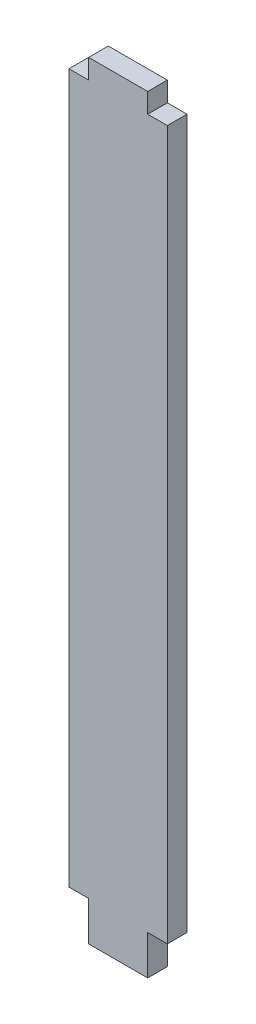
ISO-10303-21;
HEADER;
FILE_DESCRIPTION(('STEP AP214'),'2;1');
FILE_NAME('part.step','',(''),(''),'','','');
FILE_SCHEMA(('AUTOMOTIVE_DESIGN { 1 0 10303 214 1 1 1 1 }'));
ENDSEC;
DATA;
#1=APPLICATION_CONTEXT('core data for automotive mechanical design processes');
#2=APPLICATION_PROTOCOL_DEFINITION('international standard','automotive_design',2000,#1);
#3=PRODUCT_CONTEXT('',#1,'mechanical');
#4=PRODUCT('Part','Part','',(#3));
#5=PRODUCT_RELATED_PRODUCT_CATEGORY('part','',(#4));
#6=PRODUCT_DEFINITION_FORMATION('','',#4);
#7=PRODUCT_DEFINITION_CONTEXT('part definition',#1,'design');
#8=PRODUCT_DEFINITION('design','',#6,#7);
#9=PRODUCT_DEFINITION_SHAPE('','',#8);
#10=(LENGTH_UNIT() NAMED_UNIT(*) SI_UNIT(.MILLI.,.METRE.));
#11=(NAMED_UNIT(*) PLANE_ANGLE_UNIT() SI_UNIT($,.RADIAN.));
#12=(NAMED_UNIT(*) SI_UNIT($,.STERADIAN.) SOLID_ANGLE_UNIT());
#13=UNCERTAINTY_MEASURE_WITH_UNIT(LENGTH_MEASURE(1.E-05),#10,'distance_accuracy_value','');
#14=(GEOMETRIC_REPRESENTATION_CONTEXT(3) GLOBAL_UNCERTAINTY_ASSIGNED_CONTEXT((#13)) GLOBAL_UNIT_ASSIGNED_CONTEXT((#10,
#11,#12)) REPRESENTATION_CONTEXT('',''));
#15=CARTESIAN_POINT('',(0.,0.,0.));
#16=DIRECTION('',(0.,0.,1.));
#17=DIRECTION('',(1.,0.,0.));
#18=AXIS2_PLACEMENT_3D('',#15,#16,#17);
#19=CARTESIAN_POINT('',(214.630903416816,0.,-5.));
#20=DIRECTION('',(-1.,0.,0.));
#21=DIRECTION('',(0.,-1.,0.));
#22=AXIS2_PLACEMENT_3D('',#19,#20,#21);
#23=PLANE('',#22);
#24=DIRECTION('',(0.,-1.,0.));
#25=VECTOR('',#24,1.);
#26=CARTESIAN_POINT('',(214.630903416816,0.,0.));
#27=LINE('',#26,#25);
#28=CARTESIAN_POINT('',(214.630903416816,191.207377047342,0.));
#29=VERTEX_POINT('',#28);
#30=CARTESIAN_POINT('',(214.630903416816,11.2073770473418,0.));
#31=VERTEX_POINT('',#30);
#32=EDGE_CURVE('E162',#29,#31,#27,.T.);
#33=ORIENTED_EDGE('',*,*,#32,.F.);
#34=DIRECTION('',(0.,0.,1.));
#35=VECTOR('',#34,1.);
#36=CARTESIAN_POINT('',(214.630903416816,191.207377047342,-5.));
#37=LINE('',#36,#35);
#38=CARTESIAN_POINT('',(214.630903416816,191.207377047342,-5.));
#39=VERTEX_POINT('',#38);
#40=EDGE_CURVE('E11',#39,#29,#37,.T.);
#41=ORIENTED_EDGE('',*,*,#40,.F.);
#42=DIRECTION('',(0.,-1.,0.));
#43=VECTOR('',#42,1.);
#44=CARTESIAN_POINT('',(214.630903416816,0.,-5.));
#45=LINE('',#44,#43);
#46=CARTESIAN_POINT('',(214.630903416816,11.2073770473418,-5.));
#47=VERTEX_POINT('',#46);
#48=EDGE_CURVE('E190',#39,#47,#45,.T.);
#49=ORIENTED_EDGE('',*,*,#48,.T.);
#50=DIRECTION('',(0.,0.,1.));
#51=VECTOR('',#50,1.);
#52=CARTESIAN_POINT('',(214.630903416816,11.2073770473418,-5.));
#53=LINE('',#52,#51);
#54=EDGE_CURVE('E42',#47,#31,#53,.T.);
#55=ORIENTED_EDGE('',*,*,#54,.T.);
#56=EDGE_LOOP('',(#33,#41,#49,#55));
#57=FACE_BOUND('',#56,.T.);
#58=ADVANCED_FACE('F39',(#57),#23,.T.);
#59=CARTESIAN_POINT('',(0.,191.207377047342,-5.));
#60=DIRECTION('',(0.,-1.,0.));
#61=DIRECTION('',(0.,0.,-1.));
#62=AXIS2_PLACEMENT_3D('',#59,#60,#61);
#63=PLANE('',#62);
#64=DIRECTION('',(1.,0.,0.));
#65=VECTOR('',#64,1.);
#66=CARTESIAN_POINT('',(0.,191.207377047342,0.));
#67=LINE('',#66,#65);
#68=CARTESIAN_POINT('',(219.630903416816,191.207377047342,0.));
#69=VERTEX_POINT('',#68);
#70=EDGE_CURVE('E96',#29,#69,#67,.T.);
#71=ORIENTED_EDGE('',*,*,#70,.T.);
#72=DIRECTION('',(0.,0.,1.));
#73=VECTOR('',#72,1.);
#74=CARTESIAN_POINT('',(219.630903416816,191.207377047342,-5.));
#75=LINE('',#74,#73);
#76=CARTESIAN_POINT('',(219.630903416816,191.207377047342,-5.));
#77=VERTEX_POINT('',#76);
#78=EDGE_CURVE('E48',#77,#69,#75,.T.);
#79=ORIENTED_EDGE('',*,*,#78,.F.);
#80=DIRECTION('',(1.,0.,0.));
#81=VECTOR('',#80,1.);
#82=CARTESIAN_POINT('',(0.,191.207377047342,-5.));
#83=LINE('',#82,#81);
#84=EDGE_CURVE('E140',#39,#77,#83,.T.);
#85=ORIENTED_EDGE('',*,*,#84,.F.);
#86=ORIENTED_EDGE('',*,*,#40,.T.);
#87=EDGE_LOOP('',(#71,#79,#85,#86));
#88=FACE_BOUND('',#87,.T.);
#89=ADVANCED_FACE('F266',(#88),#63,.F.);
#90=CARTESIAN_POINT('',(219.630903416816,0.,-5.));
#91=DIRECTION('',(1.,0.,0.));
#92=DIRECTION('',(0.,0.,-1.));
#93=AXIS2_PLACEMENT_3D('',#90,#91,#92);
#94=PLANE('',#93);
#95=DIRECTION('',(0.,1.,0.));
#96=VECTOR('',#95,1.);
#97=CARTESIAN_POINT('',(219.630903416816,0.,0.));
#98=LINE('',#97,#96);
#99=CARTESIAN_POINT('',(219.630903416816,196.207377047342,0.));
#100=VERTEX_POINT('',#99);
#101=EDGE_CURVE('E147',#69,#100,#98,.T.);
#102=ORIENTED_EDGE('',*,*,#101,.T.);
#103=DIRECTION('',(0.,0.,1.));
#104=VECTOR('',#103,1.);
#105=CARTESIAN_POINT('',(219.630903416816,196.207377047342,-5.));
#106=LINE('',#105,#104);
#107=CARTESIAN_POINT('',(219.630903416816,196.207377047342,-5.));
#108=VERTEX_POINT('',#107);
#109=EDGE_CURVE('E144',#108,#100,#106,.T.);
#110=ORIENTED_EDGE('',*,*,#109,.F.);
#111=DIRECTION('',(0.,1.,0.));
#112=VECTOR('',#111,1.);
#113=CARTESIAN_POINT('',(219.630903416816,0.,-5.));
#114=LINE('',#113,#112);
#115=EDGE_CURVE('E133',#77,#108,#114,.T.);
#116=ORIENTED_EDGE('',*,*,#115,.F.);
#117=ORIENTED_EDGE('',*,*,#78,.T.);
#118=EDGE_LOOP('',(#102,#110,#116,#117));
#119=FACE_BOUND('',#118,.T.);
#120=ADVANCED_FACE('F145',(#119),#94,.F.);
#121=CARTESIAN_POINT('',(0.,196.207377047342,-5.));
#122=DIRECTION('',(0.,-1.,0.));
#123=DIRECTION('',(0.,0.,-1.));
#124=AXIS2_PLACEMENT_3D('',#121,#122,#123);
#125=PLANE('',#124);
#126=DIRECTION('',(1.,0.,0.));
#127=VECTOR('',#126,1.);
#128=CARTESIAN_POINT('',(0.,196.207377047342,0.));
#129=LINE('',#128,#127);
#130=CARTESIAN_POINT('',(234.630903416816,196.207377047342,0.));
#131=VERTEX_POINT('',#130);
#132=EDGE_CURVE('E187',#100,#131,#129,.T.);
#133=ORIENTED_EDGE('',*,*,#132,.T.);
#134=DIRECTION('',(0.,0.,1.));
#135=VECTOR('',#134,1.);
#136=CARTESIAN_POINT('',(234.630903416816,196.207377047342,-5.));
#137=LINE('',#136,#135);
#138=CARTESIAN_POINT('',(234.630903416816,196.207377047342,-5.));
#139=VERTEX_POINT('',#138);
#140=EDGE_CURVE('E151',#139,#131,#137,.T.);
#141=ORIENTED_EDGE('',*,*,#140,.F.);
#142=DIRECTION('',(1.,0.,0.));
#143=VECTOR('',#142,1.);
#144=CARTESIAN_POINT('',(0.,196.207377047342,-5.));
#145=LINE('',#144,#143);
#146=EDGE_CURVE('E138',#108,#139,#145,.T.);
#147=ORIENTED_EDGE('',*,*,#146,.F.);
#148=ORIENTED_EDGE('',*,*,#109,.T.);
#149=EDGE_LOOP('',(#133,#141,#147,#148));
#150=FACE_BOUND('',#149,.T.);
#151=ADVANCED_FACE('F153',(#150),#125,.F.);
#152=CARTESIAN_POINT('',(234.630903416817,1.30246315630975E-12,-5.));
#153=DIRECTION('',(1.,0.,0.));
#154=DIRECTION('',(0.,1.,0.));
#155=AXIS2_PLACEMENT_3D('',#152,#153,#154);
#156=PLANE('',#155);
#157=DIRECTION('',(0.,1.,0.));
#158=VECTOR('',#157,1.);
#159=CARTESIAN_POINT('',(234.630903416817,1.30246315630975E-12,0.));
#160=LINE('',#159,#158);
#161=CARTESIAN_POINT('',(234.630903416816,191.207377047342,0.));
#162=VERTEX_POINT('',#161);
#163=EDGE_CURVE('E184',#162,#131,#160,.T.);
#164=ORIENTED_EDGE('',*,*,#163,.F.);
#165=DIRECTION('',(0.,0.,1.));
#166=VECTOR('',#165,1.);
#167=CARTESIAN_POINT('',(234.630903416816,191.207377047342,-5.));
#168=LINE('',#167,#166);
#169=CARTESIAN_POINT('',(234.630903416816,191.207377047342,-5.));
#170=VERTEX_POINT('',#169);
#171=EDGE_CURVE('E194',#170,#162,#168,.T.);
#172=ORIENTED_EDGE('',*,*,#171,.F.);
#173=DIRECTION('',(0.,1.,0.));
#174=VECTOR('',#173,1.);
#175=CARTESIAN_POINT('',(234.630903416817,1.30246315630975E-12,-5.));
#176=LINE('',#175,#174);
#177=EDGE_CURVE('E155',#170,#139,#176,.T.);
#178=ORIENTED_EDGE('',*,*,#177,.T.);
#179=ORIENTED_EDGE('',*,*,#140,.T.);
#180=EDGE_LOOP('',(#164,#172,#178,#179));
#181=FACE_BOUND('',#180,.T.);
#182=ADVANCED_FACE('F218',(#181),#156,.T.);
#183=CARTESIAN_POINT('',(0.,191.207377047342,-5.));
#184=DIRECTION('',(0.,-1.,0.));
#185=DIRECTION('',(0.,0.,-1.));
#186=AXIS2_PLACEMENT_3D('',#183,#184,#185);
#187=PLANE('',#186);
#188=DIRECTION('',(1.,0.,0.));
#189=VECTOR('',#188,1.);
#190=CARTESIAN_POINT('',(0.,191.207377047342,0.));
#191=LINE('',#190,#189);
#192=CARTESIAN_POINT('',(239.630903416816,191.207377047342,0.));
#193=VERTEX_POINT('',#192);
#194=EDGE_CURVE('E182',#162,#193,#191,.T.);
#195=ORIENTED_EDGE('',*,*,#194,.T.);
#196=DIRECTION('',(0.,0.,1.));
#197=VECTOR('',#196,1.);
#198=CARTESIAN_POINT('',(239.630903416816,191.207377047342,-5.));
#199=LINE('',#198,#197);
#200=CARTESIAN_POINT('',(239.630903416816,191.207377047342,-5.));
#201=VERTEX_POINT('',#200);
#202=EDGE_CURVE('E196',#201,#193,#199,.T.);
#203=ORIENTED_EDGE('',*,*,#202,.F.);
#204=DIRECTION('',(1.,0.,0.));
#205=VECTOR('',#204,1.);
#206=CARTESIAN_POINT('',(0.,191.207377047342,-5.));
#207=LINE('',#206,#205);
#208=EDGE_CURVE('E157',#170,#201,#207,.T.);
#209=ORIENTED_EDGE('',*,*,#208,.F.);
#210=ORIENTED_EDGE('',*,*,#171,.T.);
#211=EDGE_LOOP('',(#195,#203,#209,#210));
#212=FACE_BOUND('',#211,.T.);
#213=ADVANCED_FACE('F226',(#212),#187,.F.);
#214=CARTESIAN_POINT('',(239.630903416816,0.,-5.));
#215=DIRECTION('',(-1.,0.,0.));
#216=DIRECTION('',(0.,-1.,0.));
#217=AXIS2_PLACEMENT_3D('',#214,#215,#216);
#218=PLANE('',#217);
#219=DIRECTION('',(0.,-1.,0.));
#220=VECTOR('',#219,1.);
#221=CARTESIAN_POINT('',(239.630903416816,0.,0.));
#222=LINE('',#221,#220);
#223=CARTESIAN_POINT('',(239.630903416816,11.2073770473418,0.));
#224=VERTEX_POINT('',#223);
#225=EDGE_CURVE('E179',#193,#224,#222,.T.);
#226=ORIENTED_EDGE('',*,*,#225,.T.);
#227=DIRECTION('',(0.,0.,1.));
#228=VECTOR('',#227,1.);
#229=CARTESIAN_POINT('',(239.630903416816,11.2073770473418,-5.));
#230=LINE('',#229,#228);
#231=CARTESIAN_POINT('',(239.630903416816,11.2073770473418,-5.));
#232=VERTEX_POINT('',#231);
#233=EDGE_CURVE('E199',#232,#224,#230,.T.);
#234=ORIENTED_EDGE('',*,*,#233,.F.);
#235=DIRECTION('',(0.,-1.,0.));
#236=VECTOR('',#235,1.);
#237=CARTESIAN_POINT('',(239.630903416816,0.,-5.));
#238=LINE('',#237,#236);
#239=EDGE_CURVE('E223',#201,#232,#238,.T.);
#240=ORIENTED_EDGE('',*,*,#239,.F.);
#241=ORIENTED_EDGE('',*,*,#202,.T.);
#242=EDGE_LOOP('',(#226,#234,#240,#241));
#243=FACE_BOUND('',#242,.T.);
#244=ADVANCED_FACE('F228',(#243),#218,.F.);
#245=CARTESIAN_POINT('',(0.,11.2073770473418,-5.));
#246=DIRECTION('',(0.,-1.,0.));
#247=DIRECTION('',(0.,0.,-1.));
#248=AXIS2_PLACEMENT_3D('',#245,#246,#247);
#249=PLANE('',#248);
#250=DIRECTION('',(1.,0.,0.));
#251=VECTOR('',#250,1.);
#252=CARTESIAN_POINT('',(0.,11.2073770473418,0.));
#253=LINE('',#252,#251);
#254=CARTESIAN_POINT('',(234.630903416816,11.2073770473418,0.));
#255=VERTEX_POINT('',#254);
#256=EDGE_CURVE('E176',#255,#224,#253,.T.);
#257=ORIENTED_EDGE('',*,*,#256,.F.);
#258=DIRECTION('',(0.,0.,1.));
#259=VECTOR('',#258,1.);
#260=CARTESIAN_POINT('',(234.630903416816,11.2073770473418,-5.));
#261=LINE('',#260,#259);
#262=CARTESIAN_POINT('',(234.630903416816,11.2073770473418,-5.));
#263=VERTEX_POINT('',#262);
#264=EDGE_CURVE('E201',#263,#255,#261,.T.);
#265=ORIENTED_EDGE('',*,*,#264,.F.);
#266=DIRECTION('',(1.,0.,0.));
#267=VECTOR('',#266,1.);
#268=CARTESIAN_POINT('',(0.,11.2073770473418,-5.));
#269=LINE('',#268,#267);
#270=EDGE_CURVE('E230',#263,#232,#269,.T.);
#271=ORIENTED_EDGE('',*,*,#270,.T.);
#272=ORIENTED_EDGE('',*,*,#233,.T.);
#273=EDGE_LOOP('',(#257,#265,#271,#272));
#274=FACE_BOUND('',#273,.T.);
#275=ADVANCED_FACE('F255',(#274),#249,.T.);
#276=CARTESIAN_POINT('',(234.630903416816,0.,-5.));
#277=DIRECTION('',(-1.,0.,0.));
#278=DIRECTION('',(0.,0.,1.));
#279=AXIS2_PLACEMENT_3D('',#276,#277,#278);
#280=PLANE('',#279);
#281=DIRECTION('',(0.,-1.,0.));
#282=VECTOR('',#281,1.);
#283=CARTESIAN_POINT('',(234.630903416816,0.,0.));
#284=LINE('',#283,#282);
#285=CARTESIAN_POINT('',(234.630903416816,1.20737704734183,0.));
#286=VERTEX_POINT('',#285);
#287=EDGE_CURVE('E174',#255,#286,#284,.T.);
#288=ORIENTED_EDGE('',*,*,#287,.T.);
#289=DIRECTION('',(0.,0.,1.));
#290=VECTOR('',#289,1.);
#291=CARTESIAN_POINT('',(234.630903416816,1.20737704734183,-5.));
#292=LINE('',#291,#290);
#293=CARTESIAN_POINT('',(234.630903416816,1.20737704734183,-5.));
#294=VERTEX_POINT('',#293);
#295=EDGE_CURVE('E203',#294,#286,#292,.T.);
#296=ORIENTED_EDGE('',*,*,#295,.F.);
#297=DIRECTION('',(0.,-1.,0.));
#298=VECTOR('',#297,1.);
#299=CARTESIAN_POINT('',(234.630903416816,0.,-5.));
#300=LINE('',#299,#298);
#301=EDGE_CURVE('E232',#263,#294,#300,.T.);
#302=ORIENTED_EDGE('',*,*,#301,.F.);
#303=ORIENTED_EDGE('',*,*,#264,.T.);
#304=EDGE_LOOP('',(#288,#296,#302,#303));
#305=FACE_BOUND('',#304,.T.);
#306=ADVANCED_FACE('F256',(#305),#280,.F.);
#307=CARTESIAN_POINT('',(0.,1.20737704734183,-5.));
#308=DIRECTION('',(0.,1.,0.));
#309=DIRECTION('',(0.,0.,1.));
#310=AXIS2_PLACEMENT_3D('',#307,#308,#309);
#311=PLANE('',#310);
#312=DIRECTION('',(-1.,0.,0.));
#313=VECTOR('',#312,1.);
#314=CARTESIAN_POINT('',(0.,1.20737704734183,0.));
#315=LINE('',#314,#313);
#316=CARTESIAN_POINT('',(219.630903416816,1.20737704734183,0.));
#317=VERTEX_POINT('',#316);
#318=EDGE_CURVE('E171',#286,#317,#315,.T.);
#319=ORIENTED_EDGE('',*,*,#318,.T.);
#320=DIRECTION('',(0.,0.,1.));
#321=VECTOR('',#320,1.);
#322=CARTESIAN_POINT('',(219.630903416816,1.20737704734183,-5.));
#323=LINE('',#322,#321);
#324=CARTESIAN_POINT('',(219.630903416816,1.20737704734183,-5.));
#325=VERTEX_POINT('',#324);
#326=EDGE_CURVE('E206',#325,#317,#323,.T.);
#327=ORIENTED_EDGE('',*,*,#326,.F.);
#328=DIRECTION('',(-1.,0.,0.));
#329=VECTOR('',#328,1.);
#330=CARTESIAN_POINT('',(0.,1.20737704734183,-5.));
#331=LINE('',#330,#329);
#332=EDGE_CURVE('E236',#294,#325,#331,.T.);
#333=ORIENTED_EDGE('',*,*,#332,.F.);
#334=ORIENTED_EDGE('',*,*,#295,.T.);
#335=EDGE_LOOP('',(#319,#327,#333,#334));
#336=FACE_BOUND('',#335,.T.);
#337=ADVANCED_FACE('F249',(#336),#311,.F.);
#338=CARTESIAN_POINT('',(219.630903416816,0.,-5.));
#339=DIRECTION('',(-1.,0.,0.));
#340=DIRECTION('',(0.,0.,1.));
#341=AXIS2_PLACEMENT_3D('',#338,#339,#340);
#342=PLANE('',#341);
#343=DIRECTION('',(0.,-1.,0.));
#344=VECTOR('',#343,1.);
#345=CARTESIAN_POINT('',(219.630903416816,0.,0.));
#346=LINE('',#345,#344);
#347=CARTESIAN_POINT('',(219.630903416816,11.2073770473418,0.));
#348=VERTEX_POINT('',#347);
#349=EDGE_CURVE('E168',#348,#317,#346,.T.);
#350=ORIENTED_EDGE('',*,*,#349,.F.);
#351=DIRECTION('',(0.,0.,1.));
#352=VECTOR('',#351,1.);
#353=CARTESIAN_POINT('',(219.630903416816,11.2073770473418,-5.));
#354=LINE('',#353,#352);
#355=CARTESIAN_POINT('',(219.630903416816,11.2073770473418,-5.));
#356=VERTEX_POINT('',#355);
#357=EDGE_CURVE('E207',#356,#348,#354,.T.);
#358=ORIENTED_EDGE('',*,*,#357,.F.);
#359=DIRECTION('',(0.,-1.,0.));
#360=VECTOR('',#359,1.);
#361=CARTESIAN_POINT('',(219.630903416816,0.,-5.));
#362=LINE('',#361,#360);
#363=EDGE_CURVE('E238',#356,#325,#362,.T.);
#364=ORIENTED_EDGE('',*,*,#363,.T.);
#365=ORIENTED_EDGE('',*,*,#326,.T.);
#366=EDGE_LOOP('',(#350,#358,#364,#365));
#367=FACE_BOUND('',#366,.T.);
#368=ADVANCED_FACE('F243',(#367),#342,.T.);
#369=CARTESIAN_POINT('',(0.,11.2073770473418,-5.));
#370=DIRECTION('',(0.,1.,0.));
#371=DIRECTION('',(0.,0.,1.));
#372=AXIS2_PLACEMENT_3D('',#369,#370,#371);
#373=PLANE('',#372);
#374=DIRECTION('',(-1.,0.,0.));
#375=VECTOR('',#374,1.);
#376=CARTESIAN_POINT('',(0.,11.2073770473418,0.));
#377=LINE('',#376,#375);
#378=EDGE_CURVE('E165',#348,#31,#377,.T.);
#379=ORIENTED_EDGE('',*,*,#378,.T.);
#380=ORIENTED_EDGE('',*,*,#54,.F.);
#381=DIRECTION('',(-1.,0.,0.));
#382=VECTOR('',#381,1.);
#383=CARTESIAN_POINT('',(0.,11.2073770473418,-5.));
#384=LINE('',#383,#382);
#385=EDGE_CURVE('E106',#356,#47,#384,.T.);
#386=ORIENTED_EDGE('',*,*,#385,.F.);
#387=ORIENTED_EDGE('',*,*,#357,.T.);
#388=EDGE_LOOP('',(#379,#380,#386,#387));
#389=FACE_BOUND('',#388,.T.);
#390=ADVANCED_FACE('F210',(#389),#373,.F.);
#391=CARTESIAN_POINT('',(0.,0.,-5.));
#392=DIRECTION('',(0.,0.,1.));
#393=DIRECTION('',(1.,0.,0.));
#394=AXIS2_PLACEMENT_3D('',#391,#392,#393);
#395=PLANE('',#394);
#396=ORIENTED_EDGE('',*,*,#48,.F.);
#397=ORIENTED_EDGE('',*,*,#84,.T.);
#398=ORIENTED_EDGE('',*,*,#115,.T.);
#399=ORIENTED_EDGE('',*,*,#146,.T.);
#400=ORIENTED_EDGE('',*,*,#177,.F.);
#401=ORIENTED_EDGE('',*,*,#208,.T.);
#402=ORIENTED_EDGE('',*,*,#239,.T.);
#403=ORIENTED_EDGE('',*,*,#270,.F.);
#404=ORIENTED_EDGE('',*,*,#301,.T.);
#405=ORIENTED_EDGE('',*,*,#332,.T.);
#406=ORIENTED_EDGE('',*,*,#363,.F.);
#407=ORIENTED_EDGE('',*,*,#385,.T.);
#408=EDGE_LOOP('',(#396,#397,#398,#399,#400,#401,#402,#403,#404,#405,#406,#407));
#409=FACE_BOUND('',#408,.T.);
#410=ADVANCED_FACE('F135',(#409),#395,.F.);
#411=CARTESIAN_POINT('',(0.,0.,0.));
#412=DIRECTION('',(0.,0.,1.));
#413=DIRECTION('',(1.,0.,0.));
#414=AXIS2_PLACEMENT_3D('',#411,#412,#413);
#415=PLANE('',#414);
#416=ORIENTED_EDGE('',*,*,#32,.T.);
#417=ORIENTED_EDGE('',*,*,#378,.F.);
#418=ORIENTED_EDGE('',*,*,#349,.T.);
#419=ORIENTED_EDGE('',*,*,#318,.F.);
#420=ORIENTED_EDGE('',*,*,#287,.F.);
#421=ORIENTED_EDGE('',*,*,#256,.T.);
#422=ORIENTED_EDGE('',*,*,#225,.F.);
#423=ORIENTED_EDGE('',*,*,#194,.F.);
#424=ORIENTED_EDGE('',*,*,#163,.T.);
#425=ORIENTED_EDGE('',*,*,#132,.F.);
#426=ORIENTED_EDGE('',*,*,#101,.F.);
#427=ORIENTED_EDGE('',*,*,#70,.F.);
#428=EDGE_LOOP('',(#416,#417,#418,#419,#420,#421,#422,#423,#424,#425,#426,#427));
#429=FACE_BOUND('',#428,.T.);
#430=ADVANCED_FACE('F213',(#429),#415,.T.);
#431=CLOSED_SHELL('',(#58,#89,#120,#151,#182,#213,#244,#275,#306,#337,#368,#390,#410,#430));
#432=MANIFOLD_SOLID_BREP('B2',#431);
#433=ADVANCED_BREP_SHAPE_REPRESENTATION('',(#18,#432),#14);
#434=SHAPE_DEFINITION_REPRESENTATION(#9,#433);
ENDSEC;
END-ISO-10303-21;
